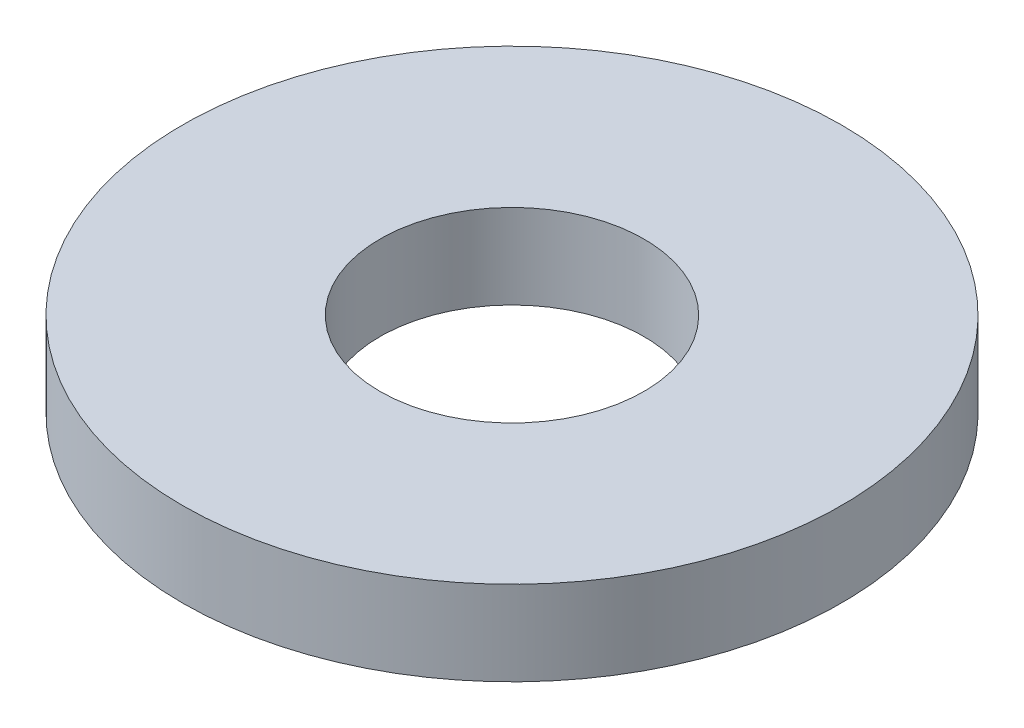
ISO-10303-21;
HEADER;
FILE_DESCRIPTION(('STEP AP214'),'2;1');
FILE_NAME('part.step','',(''),(''),'','','');
FILE_SCHEMA(('AUTOMOTIVE_DESIGN { 1 0 10303 214 1 1 1 1 }'));
ENDSEC;
DATA;
#1=APPLICATION_CONTEXT('core data for automotive mechanical design processes');
#2=APPLICATION_PROTOCOL_DEFINITION('international standard','automotive_design',2000,#1);
#3=PRODUCT_CONTEXT('',#1,'mechanical');
#4=PRODUCT('Part','Part','',(#3));
#5=PRODUCT_RELATED_PRODUCT_CATEGORY('part','',(#4));
#6=PRODUCT_DEFINITION_FORMATION('','',#4);
#7=PRODUCT_DEFINITION_CONTEXT('part definition',#1,'design');
#8=PRODUCT_DEFINITION('design','',#6,#7);
#9=PRODUCT_DEFINITION_SHAPE('','',#8);
#10=(LENGTH_UNIT() NAMED_UNIT(*) SI_UNIT(.MILLI.,.METRE.));
#11=(NAMED_UNIT(*) PLANE_ANGLE_UNIT() SI_UNIT($,.RADIAN.));
#12=(NAMED_UNIT(*) SI_UNIT($,.STERADIAN.) SOLID_ANGLE_UNIT());
#13=UNCERTAINTY_MEASURE_WITH_UNIT(LENGTH_MEASURE(1.E-05),#10,'distance_accuracy_value','');
#14=(GEOMETRIC_REPRESENTATION_CONTEXT(3) GLOBAL_UNCERTAINTY_ASSIGNED_CONTEXT((#13)) GLOBAL_UNIT_ASSIGNED_CONTEXT((#10,
#11,#12)) REPRESENTATION_CONTEXT('',''));
#15=CARTESIAN_POINT('',(0.,0.,0.));
#16=DIRECTION('',(0.,0.,1.));
#17=DIRECTION('',(1.,0.,0.));
#18=AXIS2_PLACEMENT_3D('',#15,#16,#17);
#19=CARTESIAN_POINT('',(0.,1.016,0.));
#20=DIRECTION('',(0.,-1.,0.));
#21=DIRECTION('',(0.,0.,-1.));
#22=AXIS2_PLACEMENT_3D('',#19,#20,#21);
#23=CYLINDRICAL_SURFACE('',#22,3.9624);
#24=CARTESIAN_POINT('',(0.,1.016,0.));
#25=DIRECTION('',(0.,1.,0.));
#26=DIRECTION('',(0.,0.,1.));
#27=AXIS2_PLACEMENT_3D('',#24,#25,#26);
#28=CIRCLE('',#27,3.9624);
#29=CARTESIAN_POINT('',(0.,1.016,3.9624));
#30=VERTEX_POINT('',#29);
#31=EDGE_CURVE('E10',#30,#30,#28,.T.);
#32=ORIENTED_EDGE('',*,*,#31,.F.);
#33=EDGE_LOOP('',(#32));
#34=FACE_BOUND('',#33,.T.);
#35=CARTESIAN_POINT('',(0.,0.,0.));
#36=DIRECTION('',(0.,1.,0.));
#37=DIRECTION('',(0.,0.,1.));
#38=AXIS2_PLACEMENT_3D('',#35,#36,#37);
#39=CIRCLE('',#38,3.9624);
#40=CARTESIAN_POINT('',(0.,0.,3.9624));
#41=VERTEX_POINT('',#40);
#42=EDGE_CURVE('E38',#41,#41,#39,.T.);
#43=ORIENTED_EDGE('',*,*,#42,.T.);
#44=EDGE_LOOP('',(#43));
#45=FACE_BOUND('',#44,.T.);
#46=ADVANCED_FACE('F35',(#34,#45),#23,.T.);
#47=CARTESIAN_POINT('',(0.,1.016,0.));
#48=DIRECTION('',(0.,1.,0.));
#49=DIRECTION('',(0.,0.,1.));
#50=AXIS2_PLACEMENT_3D('',#47,#48,#49);
#51=PLANE('',#50);
#52=CARTESIAN_POINT('',(0.,1.016,0.));
#53=DIRECTION('',(0.,1.,0.));
#54=DIRECTION('',(0.,0.,1.));
#55=AXIS2_PLACEMENT_3D('',#52,#53,#54);
#56=CIRCLE('',#55,1.5875);
#57=CARTESIAN_POINT('',(0.,1.016,1.5875));
#58=VERTEX_POINT('',#57);
#59=EDGE_CURVE('E47',#58,#58,#56,.T.);
#60=ORIENTED_EDGE('',*,*,#59,.F.);
#61=EDGE_LOOP('',(#60));
#62=FACE_BOUND('',#61,.T.);
#63=ORIENTED_EDGE('',*,*,#31,.T.);
#64=EDGE_LOOP('',(#63));
#65=FACE_BOUND('',#64,.T.);
#66=ADVANCED_FACE('F62',(#62,#65),#51,.T.);
#67=CARTESIAN_POINT('',(0.,0.,0.));
#68=DIRECTION('',(0.,1.,0.));
#69=DIRECTION('',(0.,0.,1.));
#70=AXIS2_PLACEMENT_3D('',#67,#68,#69);
#71=PLANE('',#70);
#72=CARTESIAN_POINT('',(0.,0.,0.));
#73=DIRECTION('',(0.,1.,0.));
#74=DIRECTION('',(0.,0.,1.));
#75=AXIS2_PLACEMENT_3D('',#72,#73,#74);
#76=CIRCLE('',#75,1.5875);
#77=CARTESIAN_POINT('',(0.,0.,1.5875));
#78=VERTEX_POINT('',#77);
#79=EDGE_CURVE('E45',#78,#78,#76,.T.);
#80=ORIENTED_EDGE('',*,*,#79,.T.);
#81=EDGE_LOOP('',(#80));
#82=FACE_BOUND('',#81,.T.);
#83=ORIENTED_EDGE('',*,*,#42,.F.);
#84=EDGE_LOOP('',(#83));
#85=FACE_BOUND('',#84,.T.);
#86=ADVANCED_FACE('F53',(#82,#85),#71,.F.);
#87=CARTESIAN_POINT('',(0.,0.,0.));
#88=DIRECTION('',(0.,1.,0.));
#89=DIRECTION('',(0.,0.,1.));
#90=AXIS2_PLACEMENT_3D('',#87,#88,#89);
#91=CYLINDRICAL_SURFACE('',#90,1.5875);
#92=ORIENTED_EDGE('',*,*,#79,.F.);
#93=EDGE_LOOP('',(#92));
#94=FACE_BOUND('',#93,.T.);
#95=ORIENTED_EDGE('',*,*,#59,.T.);
#96=EDGE_LOOP('',(#95));
#97=FACE_BOUND('',#96,.T.);
#98=ADVANCED_FACE('F56',(#94,#97),#91,.F.);
#99=CLOSED_SHELL('',(#46,#66,#86,#98));
#100=MANIFOLD_SOLID_BREP('B2',#99);
#101=ADVANCED_BREP_SHAPE_REPRESENTATION('',(#18,#100),#14);
#102=SHAPE_DEFINITION_REPRESENTATION(#9,#101);
ENDSEC;
END-ISO-10303-21;
